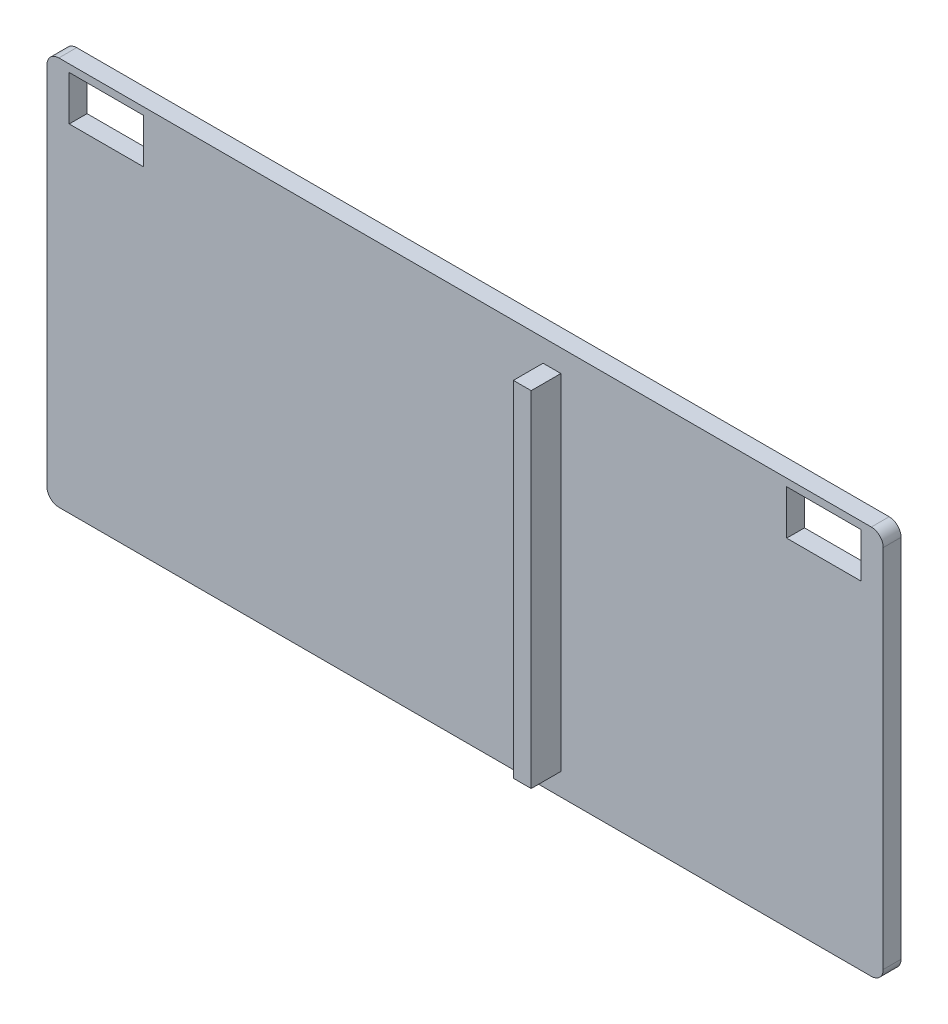
ISO-10303-21;
HEADER;
FILE_DESCRIPTION(('STEP AP214'),'2;1');
FILE_NAME('part.step','',(''),(''),'','','');
FILE_SCHEMA(('AUTOMOTIVE_DESIGN { 1 0 10303 214 1 1 1 1 }'));
ENDSEC;
DATA;
#1=APPLICATION_CONTEXT('core data for automotive mechanical design processes');
#2=APPLICATION_PROTOCOL_DEFINITION('international standard','automotive_design',2000,#1);
#3=PRODUCT_CONTEXT('',#1,'mechanical');
#4=PRODUCT('Part','Part','',(#3));
#5=PRODUCT_RELATED_PRODUCT_CATEGORY('part','',(#4));
#6=PRODUCT_DEFINITION_FORMATION('','',#4);
#7=PRODUCT_DEFINITION_CONTEXT('part definition',#1,'design');
#8=PRODUCT_DEFINITION('design','',#6,#7);
#9=PRODUCT_DEFINITION_SHAPE('','',#8);
#10=(LENGTH_UNIT() NAMED_UNIT(*) SI_UNIT(.MILLI.,.METRE.));
#11=(NAMED_UNIT(*) PLANE_ANGLE_UNIT() SI_UNIT($,.RADIAN.));
#12=(NAMED_UNIT(*) SI_UNIT($,.STERADIAN.) SOLID_ANGLE_UNIT());
#13=UNCERTAINTY_MEASURE_WITH_UNIT(LENGTH_MEASURE(1.E-05),#10,'distance_accuracy_value','');
#14=(GEOMETRIC_REPRESENTATION_CONTEXT(3) GLOBAL_UNCERTAINTY_ASSIGNED_CONTEXT((#13)) GLOBAL_UNIT_ASSIGNED_CONTEXT((#10,
#11,#12)) REPRESENTATION_CONTEXT('',''));
#15=CARTESIAN_POINT('',(0.,0.,0.));
#16=DIRECTION('',(0.,0.,1.));
#17=DIRECTION('',(1.,0.,0.));
#18=AXIS2_PLACEMENT_3D('',#15,#16,#17);
#19=CARTESIAN_POINT('',(5.25,-11.6,11.8));
#20=DIRECTION('',(0.,0.,1.));
#21=DIRECTION('',(1.,0.,0.));
#22=AXIS2_PLACEMENT_3D('',#19,#20,#21);
#23=PLANE('',#22);
#24=DIRECTION('',(0.,1.,0.));
#25=VECTOR('',#24,1.);
#26=CARTESIAN_POINT('',(5.25,-11.6,11.8));
#27=LINE('',#26,#25);
#28=CARTESIAN_POINT('',(5.25,-11.6,11.8));
#29=VERTEX_POINT('',#28);
#30=CARTESIAN_POINT('',(5.25,11.6,11.8));
#31=VERTEX_POINT('',#30);
#32=EDGE_CURVE('E208',#29,#31,#27,.T.);
#33=ORIENTED_EDGE('',*,*,#32,.F.);
#34=DIRECTION('',(1.,0.,0.));
#35=VECTOR('',#34,1.);
#36=CARTESIAN_POINT('',(5.25,-11.6,11.8));
#37=LINE('',#36,#35);
#38=CARTESIAN_POINT('',(6.45,-11.6,11.8));
#39=VERTEX_POINT('',#38);
#40=EDGE_CURVE('E325',#29,#39,#37,.T.);
#41=ORIENTED_EDGE('',*,*,#40,.T.);
#42=DIRECTION('',(0.,1.,0.));
#43=VECTOR('',#42,1.);
#44=CARTESIAN_POINT('',(6.45,-11.6,11.8));
#45=LINE('',#44,#43);
#46=CARTESIAN_POINT('',(6.45,11.6,11.8));
#47=VERTEX_POINT('',#46);
#48=EDGE_CURVE('E40',#39,#47,#45,.T.);
#49=ORIENTED_EDGE('',*,*,#48,.T.);
#50=DIRECTION('',(1.,0.,0.));
#51=VECTOR('',#50,1.);
#52=CARTESIAN_POINT('',(5.25,11.6,11.8));
#53=LINE('',#52,#51);
#54=EDGE_CURVE('E364',#31,#47,#53,.T.);
#55=ORIENTED_EDGE('',*,*,#54,.F.);
#56=EDGE_LOOP('',(#33,#41,#49,#55));
#57=FACE_BOUND('',#56,.T.);
#58=ADVANCED_FACE('F16',(#57),#23,.T.);
#59=CARTESIAN_POINT('',(21.65,12.6,8.6));
#60=DIRECTION('',(0.,1.,0.));
#61=DIRECTION('',(1.,0.,0.));
#62=AXIS2_PLACEMENT_3D('',#59,#60,#61);
#63=PLANE('',#62);
#64=DIRECTION('',(0.,0.,1.));
#65=VECTOR('',#64,1.);
#66=CARTESIAN_POINT('',(26.65,12.6,8.6));
#67=LINE('',#66,#65);
#68=CARTESIAN_POINT('',(26.65,12.6,8.6));
#69=VERTEX_POINT('',#68);
#70=CARTESIAN_POINT('',(26.65,12.6,9.8));
#71=VERTEX_POINT('',#70);
#72=EDGE_CURVE('E10',#69,#71,#67,.T.);
#73=ORIENTED_EDGE('',*,*,#72,.T.);
#74=DIRECTION('',(1.,0.,0.));
#75=VECTOR('',#74,1.);
#76=CARTESIAN_POINT('',(21.65,12.6,9.8));
#77=LINE('',#76,#75);
#78=CARTESIAN_POINT('',(21.65,12.6,9.8));
#79=VERTEX_POINT('',#78);
#80=EDGE_CURVE('E271',#79,#71,#77,.T.);
#81=ORIENTED_EDGE('',*,*,#80,.F.);
#82=DIRECTION('',(0.,0.,1.));
#83=VECTOR('',#82,1.);
#84=CARTESIAN_POINT('',(21.65,12.6,8.6));
#85=LINE('',#84,#83);
#86=CARTESIAN_POINT('',(21.65,12.6,8.6));
#87=VERTEX_POINT('',#86);
#88=EDGE_CURVE('E391',#87,#79,#85,.T.);
#89=ORIENTED_EDGE('',*,*,#88,.F.);
#90=DIRECTION('',(1.,0.,0.));
#91=VECTOR('',#90,1.);
#92=CARTESIAN_POINT('',(21.65,12.6,8.6));
#93=LINE('',#92,#91);
#94=EDGE_CURVE('E345',#87,#69,#93,.T.);
#95=ORIENTED_EDGE('',*,*,#94,.T.);
#96=EDGE_LOOP('',(#73,#81,#89,#95));
#97=FACE_BOUND('',#96,.T.);
#98=ADVANCED_FACE('F411',(#97),#63,.F.);
#99=CARTESIAN_POINT('',(26.65,9.6,8.6));
#100=DIRECTION('',(1.,0.,0.));
#101=DIRECTION('',(0.,1.,0.));
#102=AXIS2_PLACEMENT_3D('',#99,#100,#101);
#103=PLANE('',#102);
#104=DIRECTION('',(0.,1.,0.));
#105=VECTOR('',#104,1.);
#106=CARTESIAN_POINT('',(26.65,9.6,9.8));
#107=LINE('',#106,#105);
#108=CARTESIAN_POINT('',(26.65,9.6,9.8));
#109=VERTEX_POINT('',#108);
#110=EDGE_CURVE('E273',#109,#71,#107,.T.);
#111=ORIENTED_EDGE('',*,*,#110,.T.);
#112=ORIENTED_EDGE('',*,*,#72,.F.);
#113=DIRECTION('',(0.,1.,0.));
#114=VECTOR('',#113,1.);
#115=CARTESIAN_POINT('',(26.65,9.6,8.6));
#116=LINE('',#115,#114);
#117=CARTESIAN_POINT('',(26.65,9.6,8.6));
#118=VERTEX_POINT('',#117);
#119=EDGE_CURVE('E339',#118,#69,#116,.T.);
#120=ORIENTED_EDGE('',*,*,#119,.F.);
#121=DIRECTION('',(0.,0.,1.));
#122=VECTOR('',#121,1.);
#123=CARTESIAN_POINT('',(26.65,9.6,8.6));
#124=LINE('',#123,#122);
#125=EDGE_CURVE('E19',#118,#109,#124,.T.);
#126=ORIENTED_EDGE('',*,*,#125,.T.);
#127=EDGE_LOOP('',(#111,#112,#120,#126));
#128=FACE_BOUND('',#127,.T.);
#129=ADVANCED_FACE('F401',(#128),#103,.F.);
#130=CARTESIAN_POINT('',(21.65,9.6,8.6));
#131=DIRECTION('',(0.,1.,0.));
#132=DIRECTION('',(1.,0.,0.));
#133=AXIS2_PLACEMENT_3D('',#130,#131,#132);
#134=PLANE('',#133);
#135=DIRECTION('',(1.,0.,0.));
#136=VECTOR('',#135,1.);
#137=CARTESIAN_POINT('',(21.65,9.6,8.6));
#138=LINE('',#137,#136);
#139=CARTESIAN_POINT('',(21.65,9.6,8.6));
#140=VERTEX_POINT('',#139);
#141=EDGE_CURVE('E331',#140,#118,#138,.T.);
#142=ORIENTED_EDGE('',*,*,#141,.F.);
#143=DIRECTION('',(0.,0.,1.));
#144=VECTOR('',#143,1.);
#145=CARTESIAN_POINT('',(21.65,9.6,8.6));
#146=LINE('',#145,#144);
#147=CARTESIAN_POINT('',(21.65,9.6,9.8));
#148=VERTEX_POINT('',#147);
#149=EDGE_CURVE('E386',#140,#148,#146,.T.);
#150=ORIENTED_EDGE('',*,*,#149,.T.);
#151=DIRECTION('',(1.,0.,0.));
#152=VECTOR('',#151,1.);
#153=CARTESIAN_POINT('',(21.65,9.6,9.8));
#154=LINE('',#153,#152);
#155=EDGE_CURVE('E276',#148,#109,#154,.T.);
#156=ORIENTED_EDGE('',*,*,#155,.T.);
#157=ORIENTED_EDGE('',*,*,#125,.F.);
#158=EDGE_LOOP('',(#142,#150,#156,#157));
#159=FACE_BOUND('',#158,.T.);
#160=ADVANCED_FACE('F410',(#159),#134,.T.);
#161=CARTESIAN_POINT('',(21.65,9.6,8.6));
#162=DIRECTION('',(1.,0.,0.));
#163=DIRECTION('',(0.,1.,0.));
#164=AXIS2_PLACEMENT_3D('',#161,#162,#163);
#165=PLANE('',#164);
#166=ORIENTED_EDGE('',*,*,#149,.F.);
#167=DIRECTION('',(0.,1.,0.));
#168=VECTOR('',#167,1.);
#169=CARTESIAN_POINT('',(21.65,9.6,8.6));
#170=LINE('',#169,#168);
#171=EDGE_CURVE('E350',#140,#87,#170,.T.);
#172=ORIENTED_EDGE('',*,*,#171,.T.);
#173=ORIENTED_EDGE('',*,*,#88,.T.);
#174=DIRECTION('',(0.,1.,0.));
#175=VECTOR('',#174,1.);
#176=CARTESIAN_POINT('',(21.65,9.6,9.8));
#177=LINE('',#176,#175);
#178=EDGE_CURVE('E270',#148,#79,#177,.T.);
#179=ORIENTED_EDGE('',*,*,#178,.F.);
#180=EDGE_LOOP('',(#166,#172,#173,#179));
#181=FACE_BOUND('',#180,.T.);
#182=ADVANCED_FACE('F417',(#181),#165,.T.);
#183=CARTESIAN_POINT('',(-21.65,9.6,8.6));
#184=DIRECTION('',(1.,0.,0.));
#185=DIRECTION('',(0.,1.,0.));
#186=AXIS2_PLACEMENT_3D('',#183,#184,#185);
#187=PLANE('',#186);
#188=DIRECTION('',(0.,1.,0.));
#189=VECTOR('',#188,1.);
#190=CARTESIAN_POINT('',(-21.65,9.6,9.8));
#191=LINE('',#190,#189);
#192=CARTESIAN_POINT('',(-21.65,9.6,9.8));
#193=VERTEX_POINT('',#192);
#194=CARTESIAN_POINT('',(-21.65,12.6,9.8));
#195=VERTEX_POINT('',#194);
#196=EDGE_CURVE('E265',#193,#195,#191,.T.);
#197=ORIENTED_EDGE('',*,*,#196,.T.);
#198=DIRECTION('',(0.,0.,1.));
#199=VECTOR('',#198,1.);
#200=CARTESIAN_POINT('',(-21.65,12.6,8.6));
#201=LINE('',#200,#199);
#202=CARTESIAN_POINT('',(-21.65,12.6,8.6));
#203=VERTEX_POINT('',#202);
#204=EDGE_CURVE('E382',#203,#195,#201,.T.);
#205=ORIENTED_EDGE('',*,*,#204,.F.);
#206=DIRECTION('',(0.,1.,0.));
#207=VECTOR('',#206,1.);
#208=CARTESIAN_POINT('',(-21.65,9.6,8.6));
#209=LINE('',#208,#207);
#210=CARTESIAN_POINT('',(-21.65,9.6,8.6));
#211=VERTEX_POINT('',#210);
#212=EDGE_CURVE('E318',#211,#203,#209,.T.);
#213=ORIENTED_EDGE('',*,*,#212,.F.);
#214=DIRECTION('',(0.,0.,1.));
#215=VECTOR('',#214,1.);
#216=CARTESIAN_POINT('',(-21.65,9.6,8.6));
#217=LINE('',#216,#215);
#218=EDGE_CURVE('E387',#211,#193,#217,.T.);
#219=ORIENTED_EDGE('',*,*,#218,.T.);
#220=EDGE_LOOP('',(#197,#205,#213,#219));
#221=FACE_BOUND('',#220,.T.);
#222=ADVANCED_FACE('F420',(#221),#187,.F.);
#223=CARTESIAN_POINT('',(-26.65,9.6,8.6));
#224=DIRECTION('',(0.,1.,0.));
#225=DIRECTION('',(1.,0.,0.));
#226=AXIS2_PLACEMENT_3D('',#223,#224,#225);
#227=PLANE('',#226);
#228=DIRECTION('',(1.,0.,0.));
#229=VECTOR('',#228,1.);
#230=CARTESIAN_POINT('',(-26.65,9.6,8.6));
#231=LINE('',#230,#229);
#232=CARTESIAN_POINT('',(-26.65,9.6,8.6));
#233=VERTEX_POINT('',#232);
#234=EDGE_CURVE('E314',#233,#211,#231,.T.);
#235=ORIENTED_EDGE('',*,*,#234,.F.);
#236=DIRECTION('',(0.,0.,1.));
#237=VECTOR('',#236,1.);
#238=CARTESIAN_POINT('',(-26.65,9.6,8.6));
#239=LINE('',#238,#237);
#240=CARTESIAN_POINT('',(-26.65,9.6,9.8));
#241=VERTEX_POINT('',#240);
#242=EDGE_CURVE('E321',#233,#241,#239,.T.);
#243=ORIENTED_EDGE('',*,*,#242,.T.);
#244=DIRECTION('',(1.,0.,0.));
#245=VECTOR('',#244,1.);
#246=CARTESIAN_POINT('',(-26.65,9.6,9.8));
#247=LINE('',#246,#245);
#248=EDGE_CURVE('E263',#241,#193,#247,.T.);
#249=ORIENTED_EDGE('',*,*,#248,.T.);
#250=ORIENTED_EDGE('',*,*,#218,.F.);
#251=EDGE_LOOP('',(#235,#243,#249,#250));
#252=FACE_BOUND('',#251,.T.);
#253=ADVANCED_FACE('F426',(#252),#227,.T.);
#254=CARTESIAN_POINT('',(-26.65,12.6,8.6));
#255=DIRECTION('',(0.,1.,0.));
#256=DIRECTION('',(1.,0.,0.));
#257=AXIS2_PLACEMENT_3D('',#254,#255,#256);
#258=PLANE('',#257);
#259=ORIENTED_EDGE('',*,*,#204,.T.);
#260=DIRECTION('',(1.,0.,0.));
#261=VECTOR('',#260,1.);
#262=CARTESIAN_POINT('',(-26.65,12.6,9.8));
#263=LINE('',#262,#261);
#264=CARTESIAN_POINT('',(-26.65,12.6,9.8));
#265=VERTEX_POINT('',#264);
#266=EDGE_CURVE('E238',#265,#195,#263,.T.);
#267=ORIENTED_EDGE('',*,*,#266,.F.);
#268=DIRECTION('',(0.,0.,1.));
#269=VECTOR('',#268,1.);
#270=CARTESIAN_POINT('',(-26.65,12.6,8.6));
#271=LINE('',#270,#269);
#272=CARTESIAN_POINT('',(-26.65,12.6,8.6));
#273=VERTEX_POINT('',#272);
#274=EDGE_CURVE('E379',#273,#265,#271,.T.);
#275=ORIENTED_EDGE('',*,*,#274,.F.);
#276=DIRECTION('',(1.,0.,0.));
#277=VECTOR('',#276,1.);
#278=CARTESIAN_POINT('',(-26.65,12.6,8.6));
#279=LINE('',#278,#277);
#280=EDGE_CURVE('E326',#273,#203,#279,.T.);
#281=ORIENTED_EDGE('',*,*,#280,.T.);
#282=EDGE_LOOP('',(#259,#267,#275,#281));
#283=FACE_BOUND('',#282,.T.);
#284=ADVANCED_FACE('F521',(#283),#258,.F.);
#285=CARTESIAN_POINT('',(-26.65,9.6,8.6));
#286=DIRECTION('',(1.,0.,0.));
#287=DIRECTION('',(0.,1.,0.));
#288=AXIS2_PLACEMENT_3D('',#285,#286,#287);
#289=PLANE('',#288);
#290=ORIENTED_EDGE('',*,*,#242,.F.);
#291=DIRECTION('',(0.,1.,0.));
#292=VECTOR('',#291,1.);
#293=CARTESIAN_POINT('',(-26.65,9.6,8.6));
#294=LINE('',#293,#292);
#295=EDGE_CURVE('E329',#233,#273,#294,.T.);
#296=ORIENTED_EDGE('',*,*,#295,.T.);
#297=ORIENTED_EDGE('',*,*,#274,.T.);
#298=DIRECTION('',(0.,1.,0.));
#299=VECTOR('',#298,1.);
#300=CARTESIAN_POINT('',(-26.65,9.6,9.8));
#301=LINE('',#300,#299);
#302=EDGE_CURVE('E234',#241,#265,#301,.T.);
#303=ORIENTED_EDGE('',*,*,#302,.F.);
#304=EDGE_LOOP('',(#290,#296,#297,#303));
#305=FACE_BOUND('',#304,.T.);
#306=ADVANCED_FACE('F520',(#305),#289,.T.);
#307=CARTESIAN_POINT('',(6.45,-11.6,9.8));
#308=DIRECTION('',(1.,0.,0.));
#309=DIRECTION('',(0.,1.,0.));
#310=AXIS2_PLACEMENT_3D('',#307,#308,#309);
#311=PLANE('',#310);
#312=DIRECTION('',(0.,0.,1.));
#313=VECTOR('',#312,1.);
#314=CARTESIAN_POINT('',(6.45,-11.6,9.8));
#315=LINE('',#314,#313);
#316=CARTESIAN_POINT('',(6.45,-11.6,9.8));
#317=VERTEX_POINT('',#316);
#318=EDGE_CURVE('E375',#317,#39,#315,.T.);
#319=ORIENTED_EDGE('',*,*,#318,.F.);
#320=DIRECTION('',(0.,1.,0.));
#321=VECTOR('',#320,1.);
#322=CARTESIAN_POINT('',(6.45,-11.6,9.8));
#323=LINE('',#322,#321);
#324=CARTESIAN_POINT('',(6.45,11.6,9.8));
#325=VERTEX_POINT('',#324);
#326=EDGE_CURVE('E254',#317,#325,#323,.T.);
#327=ORIENTED_EDGE('',*,*,#326,.T.);
#328=DIRECTION('',(0.,0.,1.));
#329=VECTOR('',#328,1.);
#330=CARTESIAN_POINT('',(6.45,11.6,9.8));
#331=LINE('',#330,#329);
#332=EDGE_CURVE('E369',#325,#47,#331,.T.);
#333=ORIENTED_EDGE('',*,*,#332,.T.);
#334=ORIENTED_EDGE('',*,*,#48,.F.);
#335=EDGE_LOOP('',(#319,#327,#333,#334));
#336=FACE_BOUND('',#335,.T.);
#337=ADVANCED_FACE('F519',(#336),#311,.T.);
#338=CARTESIAN_POINT('',(5.25,-11.6,9.8));
#339=DIRECTION('',(0.,1.,0.));
#340=DIRECTION('',(1.,0.,0.));
#341=AXIS2_PLACEMENT_3D('',#338,#339,#340);
#342=PLANE('',#341);
#343=ORIENTED_EDGE('',*,*,#318,.T.);
#344=ORIENTED_EDGE('',*,*,#40,.F.);
#345=DIRECTION('',(0.,0.,1.));
#346=VECTOR('',#345,1.);
#347=CARTESIAN_POINT('',(5.25,-11.6,9.8));
#348=LINE('',#347,#346);
#349=CARTESIAN_POINT('',(5.25,-11.6,9.8));
#350=VERTEX_POINT('',#349);
#351=EDGE_CURVE('E363',#350,#29,#348,.T.);
#352=ORIENTED_EDGE('',*,*,#351,.F.);
#353=DIRECTION('',(1.,0.,0.));
#354=VECTOR('',#353,1.);
#355=CARTESIAN_POINT('',(5.25,-11.6,9.8));
#356=LINE('',#355,#354);
#357=EDGE_CURVE('E237',#350,#317,#356,.T.);
#358=ORIENTED_EDGE('',*,*,#357,.T.);
#359=EDGE_LOOP('',(#343,#344,#352,#358));
#360=FACE_BOUND('',#359,.T.);
#361=ADVANCED_FACE('F441',(#360),#342,.F.);
#362=CARTESIAN_POINT('',(5.25,11.6,9.8));
#363=DIRECTION('',(0.,1.,0.));
#364=DIRECTION('',(1.,0.,0.));
#365=AXIS2_PLACEMENT_3D('',#362,#363,#364);
#366=PLANE('',#365);
#367=DIRECTION('',(1.,0.,0.));
#368=VECTOR('',#367,1.);
#369=CARTESIAN_POINT('',(5.25,11.6,9.8));
#370=LINE('',#369,#368);
#371=CARTESIAN_POINT('',(5.25,11.6,9.8));
#372=VERTEX_POINT('',#371);
#373=EDGE_CURVE('E253',#372,#325,#370,.T.);
#374=ORIENTED_EDGE('',*,*,#373,.F.);
#375=DIRECTION('',(0.,0.,1.));
#376=VECTOR('',#375,1.);
#377=CARTESIAN_POINT('',(5.25,11.6,9.8));
#378=LINE('',#377,#376);
#379=EDGE_CURVE('E360',#372,#31,#378,.T.);
#380=ORIENTED_EDGE('',*,*,#379,.T.);
#381=ORIENTED_EDGE('',*,*,#54,.T.);
#382=ORIENTED_EDGE('',*,*,#332,.F.);
#383=EDGE_LOOP('',(#374,#380,#381,#382));
#384=FACE_BOUND('',#383,.T.);
#385=ADVANCED_FACE('F527',(#384),#366,.T.);
#386=CARTESIAN_POINT('',(5.25,-11.6,9.8));
#387=DIRECTION('',(1.,0.,0.));
#388=DIRECTION('',(0.,1.,0.));
#389=AXIS2_PLACEMENT_3D('',#386,#387,#388);
#390=PLANE('',#389);
#391=ORIENTED_EDGE('',*,*,#32,.T.);
#392=ORIENTED_EDGE('',*,*,#379,.F.);
#393=DIRECTION('',(0.,1.,0.));
#394=VECTOR('',#393,1.);
#395=CARTESIAN_POINT('',(5.25,-11.6,9.8));
#396=LINE('',#395,#394);
#397=EDGE_CURVE('E250',#350,#372,#396,.T.);
#398=ORIENTED_EDGE('',*,*,#397,.F.);
#399=ORIENTED_EDGE('',*,*,#351,.T.);
#400=EDGE_LOOP('',(#391,#392,#398,#399));
#401=FACE_BOUND('',#400,.T.);
#402=ADVANCED_FACE('F437',(#401),#390,.F.);
#403=CARTESIAN_POINT('',(28.15,-13.1,8.6));
#404=DIRECTION('',(1.,0.,0.));
#405=DIRECTION('',(0.,1.,0.));
#406=AXIS2_PLACEMENT_3D('',#403,#404,#405);
#407=PLANE('',#406);
#408=DIRECTION('',(0.,1.,0.));
#409=VECTOR('',#408,1.);
#410=CARTESIAN_POINT('',(28.15,-13.1,9.8));
#411=LINE('',#410,#409);
#412=CARTESIAN_POINT('',(28.15,-12.3,9.8));
#413=VERTEX_POINT('',#412);
#414=CARTESIAN_POINT('',(28.15,12.3,9.8));
#415=VERTEX_POINT('',#414);
#416=EDGE_CURVE('E199',#413,#415,#411,.T.);
#417=ORIENTED_EDGE('',*,*,#416,.F.);
#418=DIRECTION('',(0.,0.,1.));
#419=VECTOR('',#418,1.);
#420=CARTESIAN_POINT('',(28.15,-12.3,8.6));
#421=LINE('',#420,#419);
#422=CARTESIAN_POINT('',(28.15,-12.3,8.6));
#423=VERTEX_POINT('',#422);
#424=EDGE_CURVE('E207',#423,#413,#421,.T.);
#425=ORIENTED_EDGE('',*,*,#424,.F.);
#426=DIRECTION('',(0.,1.,0.));
#427=VECTOR('',#426,1.);
#428=CARTESIAN_POINT('',(28.15,-13.1,8.6));
#429=LINE('',#428,#427);
#430=CARTESIAN_POINT('',(28.15,12.3,8.6));
#431=VERTEX_POINT('',#430);
#432=EDGE_CURVE('E201',#423,#431,#429,.T.);
#433=ORIENTED_EDGE('',*,*,#432,.T.);
#434=DIRECTION('',(0.,0.,1.));
#435=VECTOR('',#434,1.);
#436=CARTESIAN_POINT('',(28.15,12.3,8.6));
#437=LINE('',#436,#435);
#438=EDGE_CURVE('E198',#431,#415,#437,.T.);
#439=ORIENTED_EDGE('',*,*,#438,.T.);
#440=EDGE_LOOP('',(#417,#425,#433,#439));
#441=FACE_BOUND('',#440,.T.);
#442=ADVANCED_FACE('F196',(#441),#407,.T.);
#443=CARTESIAN_POINT('',(27.35,12.3,8.6));
#444=DIRECTION('',(0.,0.,1.));
#445=DIRECTION('',(1.,0.,0.));
#446=AXIS2_PLACEMENT_3D('',#443,#444,#445);
#447=CYLINDRICAL_SURFACE('',#446,0.8);
#448=CARTESIAN_POINT('',(27.35,12.3,8.6));
#449=DIRECTION('',(0.,0.,1.));
#450=DIRECTION('',(0.,-1.,0.));
#451=AXIS2_PLACEMENT_3D('',#448,#449,#450);
#452=CIRCLE('',#451,0.8);
#453=CARTESIAN_POINT('',(27.35,13.1,8.6));
#454=VERTEX_POINT('',#453);
#455=EDGE_CURVE('E301',#431,#454,#452,.T.);
#456=ORIENTED_EDGE('',*,*,#455,.T.);
#457=DIRECTION('',(0.,0.,1.));
#458=VECTOR('',#457,1.);
#459=CARTESIAN_POINT('',(27.35,13.1,8.6));
#460=LINE('',#459,#458);
#461=CARTESIAN_POINT('',(27.35,13.1,9.8));
#462=VERTEX_POINT('',#461);
#463=EDGE_CURVE('E212',#454,#462,#460,.T.);
#464=ORIENTED_EDGE('',*,*,#463,.T.);
#465=CARTESIAN_POINT('',(27.35,12.3,9.8));
#466=DIRECTION('',(0.,0.,1.));
#467=DIRECTION('',(0.,-1.,0.));
#468=AXIS2_PLACEMENT_3D('',#465,#466,#467);
#469=CIRCLE('',#468,0.8);
#470=EDGE_CURVE('E215',#415,#462,#469,.T.);
#471=ORIENTED_EDGE('',*,*,#470,.F.);
#472=ORIENTED_EDGE('',*,*,#438,.F.);
#473=EDGE_LOOP('',(#456,#464,#471,#472));
#474=FACE_BOUND('',#473,.T.);
#475=ADVANCED_FACE('F213',(#474),#447,.T.);
#476=CARTESIAN_POINT('',(27.35,-12.3,8.6));
#477=DIRECTION('',(0.,0.,1.));
#478=DIRECTION('',(1.,0.,0.));
#479=AXIS2_PLACEMENT_3D('',#476,#477,#478);
#480=CYLINDRICAL_SURFACE('',#479,0.8);
#481=ORIENTED_EDGE('',*,*,#424,.T.);
#482=CARTESIAN_POINT('',(27.35,-12.3,9.8));
#483=DIRECTION('',(0.,0.,-1.));
#484=DIRECTION('',(0.,-1.,0.));
#485=AXIS2_PLACEMENT_3D('',#482,#483,#484);
#486=CIRCLE('',#485,0.8);
#487=CARTESIAN_POINT('',(27.35,-13.1,9.8));
#488=VERTEX_POINT('',#487);
#489=EDGE_CURVE('E223',#413,#488,#486,.T.);
#490=ORIENTED_EDGE('',*,*,#489,.T.);
#491=DIRECTION('',(0.,0.,1.));
#492=VECTOR('',#491,1.);
#493=CARTESIAN_POINT('',(27.35,-13.1,8.6));
#494=LINE('',#493,#492);
#495=CARTESIAN_POINT('',(27.35,-13.1,8.6));
#496=VERTEX_POINT('',#495);
#497=EDGE_CURVE('E245',#496,#488,#494,.T.);
#498=ORIENTED_EDGE('',*,*,#497,.F.);
#499=CARTESIAN_POINT('',(27.35,-12.3,8.6));
#500=DIRECTION('',(0.,0.,-1.));
#501=DIRECTION('',(0.,-1.,0.));
#502=AXIS2_PLACEMENT_3D('',#499,#500,#501);
#503=CIRCLE('',#502,0.8);
#504=EDGE_CURVE('E308',#423,#496,#503,.T.);
#505=ORIENTED_EDGE('',*,*,#504,.F.);
#506=EDGE_LOOP('',(#481,#490,#498,#505));
#507=FACE_BOUND('',#506,.T.);
#508=ADVANCED_FACE('F485',(#507),#480,.T.);
#509=CARTESIAN_POINT('',(-28.15,13.1,8.6));
#510=DIRECTION('',(0.,1.,0.));
#511=DIRECTION('',(1.,0.,0.));
#512=AXIS2_PLACEMENT_3D('',#509,#510,#511);
#513=PLANE('',#512);
#514=DIRECTION('',(1.,0.,0.));
#515=VECTOR('',#514,1.);
#516=CARTESIAN_POINT('',(-28.15,13.1,8.6));
#517=LINE('',#516,#515);
#518=CARTESIAN_POINT('',(-27.35,13.1,8.6));
#519=VERTEX_POINT('',#518);
#520=EDGE_CURVE('E300',#519,#454,#517,.T.);
#521=ORIENTED_EDGE('',*,*,#520,.F.);
#522=DIRECTION('',(0.,0.,1.));
#523=VECTOR('',#522,1.);
#524=CARTESIAN_POINT('',(-27.35,13.1,8.6));
#525=LINE('',#524,#523);
#526=CARTESIAN_POINT('',(-27.35,13.1,9.8));
#527=VERTEX_POINT('',#526);
#528=EDGE_CURVE('E289',#519,#527,#525,.T.);
#529=ORIENTED_EDGE('',*,*,#528,.T.);
#530=DIRECTION('',(1.,0.,0.));
#531=VECTOR('',#530,1.);
#532=CARTESIAN_POINT('',(-28.15,13.1,9.8));
#533=LINE('',#532,#531);
#534=EDGE_CURVE('E218',#527,#462,#533,.T.);
#535=ORIENTED_EDGE('',*,*,#534,.T.);
#536=ORIENTED_EDGE('',*,*,#463,.F.);
#537=EDGE_LOOP('',(#521,#529,#535,#536));
#538=FACE_BOUND('',#537,.T.);
#539=ADVANCED_FACE('F486',(#538),#513,.T.);
#540=CARTESIAN_POINT('',(-28.15,-13.1,8.6));
#541=DIRECTION('',(0.,1.,0.));
#542=DIRECTION('',(1.,0.,0.));
#543=AXIS2_PLACEMENT_3D('',#540,#541,#542);
#544=PLANE('',#543);
#545=ORIENTED_EDGE('',*,*,#497,.T.);
#546=DIRECTION('',(1.,0.,0.));
#547=VECTOR('',#546,1.);
#548=CARTESIAN_POINT('',(-28.15,-13.1,9.8));
#549=LINE('',#548,#547);
#550=CARTESIAN_POINT('',(-27.35,-13.1,9.8));
#551=VERTEX_POINT('',#550);
#552=EDGE_CURVE('E231',#551,#488,#549,.T.);
#553=ORIENTED_EDGE('',*,*,#552,.F.);
#554=DIRECTION('',(0.,0.,1.));
#555=VECTOR('',#554,1.);
#556=CARTESIAN_POINT('',(-27.35,-13.1,8.6));
#557=LINE('',#556,#555);
#558=CARTESIAN_POINT('',(-27.35,-13.1,8.6));
#559=VERTEX_POINT('',#558);
#560=EDGE_CURVE('E290',#559,#551,#557,.T.);
#561=ORIENTED_EDGE('',*,*,#560,.F.);
#562=DIRECTION('',(1.,0.,0.));
#563=VECTOR('',#562,1.);
#564=CARTESIAN_POINT('',(-28.15,-13.1,8.6));
#565=LINE('',#564,#563);
#566=EDGE_CURVE('E309',#559,#496,#565,.T.);
#567=ORIENTED_EDGE('',*,*,#566,.T.);
#568=EDGE_LOOP('',(#545,#553,#561,#567));
#569=FACE_BOUND('',#568,.T.);
#570=ADVANCED_FACE('F479',(#569),#544,.F.);
#571=CARTESIAN_POINT('',(-28.15,-13.1,8.6));
#572=DIRECTION('',(0.,0.,1.));
#573=DIRECTION('',(1.,0.,0.));
#574=AXIS2_PLACEMENT_3D('',#571,#572,#573);
#575=PLANE('',#574);
#576=ORIENTED_EDGE('',*,*,#141,.T.);
#577=ORIENTED_EDGE('',*,*,#119,.T.);
#578=ORIENTED_EDGE('',*,*,#94,.F.);
#579=ORIENTED_EDGE('',*,*,#171,.F.);
#580=EDGE_LOOP('',(#576,#577,#578,#579));
#581=FACE_BOUND('',#580,.T.);
#582=ORIENTED_EDGE('',*,*,#234,.T.);
#583=ORIENTED_EDGE('',*,*,#212,.T.);
#584=ORIENTED_EDGE('',*,*,#280,.F.);
#585=ORIENTED_EDGE('',*,*,#295,.F.);
#586=EDGE_LOOP('',(#582,#583,#584,#585));
#587=FACE_BOUND('',#586,.T.);
#588=CARTESIAN_POINT('',(-27.35,12.3,8.6));
#589=DIRECTION('',(0.,0.,-1.));
#590=DIRECTION('',(0.,-1.,0.));
#591=AXIS2_PLACEMENT_3D('',#588,#589,#590);
#592=CIRCLE('',#591,0.8);
#593=CARTESIAN_POINT('',(-28.15,12.3,8.6));
#594=VERTEX_POINT('',#593);
#595=EDGE_CURVE('E293',#594,#519,#592,.T.);
#596=ORIENTED_EDGE('',*,*,#595,.T.);
#597=ORIENTED_EDGE('',*,*,#520,.T.);
#598=ORIENTED_EDGE('',*,*,#455,.F.);
#599=ORIENTED_EDGE('',*,*,#432,.F.);
#600=ORIENTED_EDGE('',*,*,#504,.T.);
#601=ORIENTED_EDGE('',*,*,#566,.F.);
#602=CARTESIAN_POINT('',(-27.35,-12.3,8.6));
#603=DIRECTION('',(0.,0.,1.));
#604=DIRECTION('',(0.,-1.,0.));
#605=AXIS2_PLACEMENT_3D('',#602,#603,#604);
#606=CIRCLE('',#605,0.8);
#607=CARTESIAN_POINT('',(-28.15,-12.3,8.6));
#608=VERTEX_POINT('',#607);
#609=EDGE_CURVE('E284',#608,#559,#606,.T.);
#610=ORIENTED_EDGE('',*,*,#609,.F.);
#611=DIRECTION('',(0.,1.,0.));
#612=VECTOR('',#611,1.);
#613=CARTESIAN_POINT('',(-28.15,-13.1,8.6));
#614=LINE('',#613,#612);
#615=EDGE_CURVE('E452',#608,#594,#614,.T.);
#616=ORIENTED_EDGE('',*,*,#615,.T.);
#617=EDGE_LOOP('',(#596,#597,#598,#599,#600,#601,#610,#616));
#618=FACE_BOUND('',#617,.T.);
#619=ADVANCED_FACE('F414',(#581,#587,#618),#575,.F.);
#620=CARTESIAN_POINT('',(-27.35,12.3,8.6));
#621=DIRECTION('',(0.,0.,1.));
#622=DIRECTION('',(-1.,0.,0.));
#623=AXIS2_PLACEMENT_3D('',#620,#621,#622);
#624=CYLINDRICAL_SURFACE('',#623,0.8);
#625=DIRECTION('',(0.,0.,1.));
#626=VECTOR('',#625,1.);
#627=CARTESIAN_POINT('',(-28.15,12.3,8.6));
#628=LINE('',#627,#626);
#629=CARTESIAN_POINT('',(-28.15,12.3,9.8));
#630=VERTEX_POINT('',#629);
#631=EDGE_CURVE('E455',#594,#630,#628,.T.);
#632=ORIENTED_EDGE('',*,*,#631,.T.);
#633=CARTESIAN_POINT('',(-27.35,12.3,9.8));
#634=DIRECTION('',(0.,0.,-1.));
#635=DIRECTION('',(0.,-1.,0.));
#636=AXIS2_PLACEMENT_3D('',#633,#634,#635);
#637=CIRCLE('',#636,0.8);
#638=EDGE_CURVE('E242',#630,#527,#637,.T.);
#639=ORIENTED_EDGE('',*,*,#638,.T.);
#640=ORIENTED_EDGE('',*,*,#528,.F.);
#641=ORIENTED_EDGE('',*,*,#595,.F.);
#642=EDGE_LOOP('',(#632,#639,#640,#641));
#643=FACE_BOUND('',#642,.T.);
#644=ADVANCED_FACE('F493',(#643),#624,.T.);
#645=CARTESIAN_POINT('',(-27.35,-12.3,8.6));
#646=DIRECTION('',(0.,0.,1.));
#647=DIRECTION('',(-1.,0.,0.));
#648=AXIS2_PLACEMENT_3D('',#645,#646,#647);
#649=CYLINDRICAL_SURFACE('',#648,0.8);
#650=ORIENTED_EDGE('',*,*,#609,.T.);
#651=ORIENTED_EDGE('',*,*,#560,.T.);
#652=CARTESIAN_POINT('',(-27.35,-12.3,9.8));
#653=DIRECTION('',(0.,0.,1.));
#654=DIRECTION('',(0.,-1.,0.));
#655=AXIS2_PLACEMENT_3D('',#652,#653,#654);
#656=CIRCLE('',#655,0.8);
#657=CARTESIAN_POINT('',(-28.15,-12.3,9.8));
#658=VERTEX_POINT('',#657);
#659=EDGE_CURVE('E467',#658,#551,#656,.T.);
#660=ORIENTED_EDGE('',*,*,#659,.F.);
#661=DIRECTION('',(0.,0.,1.));
#662=VECTOR('',#661,1.);
#663=CARTESIAN_POINT('',(-28.15,-12.3,8.6));
#664=LINE('',#663,#662);
#665=EDGE_CURVE('E458',#608,#658,#664,.T.);
#666=ORIENTED_EDGE('',*,*,#665,.F.);
#667=EDGE_LOOP('',(#650,#651,#660,#666));
#668=FACE_BOUND('',#667,.T.);
#669=ADVANCED_FACE('F496',(#668),#649,.T.);
#670=CARTESIAN_POINT('',(-28.15,-13.1,9.8));
#671=DIRECTION('',(0.,0.,1.));
#672=DIRECTION('',(1.,0.,0.));
#673=AXIS2_PLACEMENT_3D('',#670,#671,#672);
#674=PLANE('',#673);
#675=ORIENTED_EDGE('',*,*,#178,.T.);
#676=ORIENTED_EDGE('',*,*,#80,.T.);
#677=ORIENTED_EDGE('',*,*,#110,.F.);
#678=ORIENTED_EDGE('',*,*,#155,.F.);
#679=EDGE_LOOP('',(#675,#676,#677,#678));
#680=FACE_BOUND('',#679,.T.);
#681=ORIENTED_EDGE('',*,*,#302,.T.);
#682=ORIENTED_EDGE('',*,*,#266,.T.);
#683=ORIENTED_EDGE('',*,*,#196,.F.);
#684=ORIENTED_EDGE('',*,*,#248,.F.);
#685=EDGE_LOOP('',(#681,#682,#683,#684));
#686=FACE_BOUND('',#685,.T.);
#687=ORIENTED_EDGE('',*,*,#397,.T.);
#688=ORIENTED_EDGE('',*,*,#373,.T.);
#689=ORIENTED_EDGE('',*,*,#326,.F.);
#690=ORIENTED_EDGE('',*,*,#357,.F.);
#691=EDGE_LOOP('',(#687,#688,#689,#690));
#692=FACE_BOUND('',#691,.T.);
#693=DIRECTION('',(0.,1.,0.));
#694=VECTOR('',#693,1.);
#695=CARTESIAN_POINT('',(-28.15,-13.1,9.8));
#696=LINE('',#695,#694);
#697=EDGE_CURVE('E464',#658,#630,#696,.T.);
#698=ORIENTED_EDGE('',*,*,#697,.F.);
#699=ORIENTED_EDGE('',*,*,#659,.T.);
#700=ORIENTED_EDGE('',*,*,#552,.T.);
#701=ORIENTED_EDGE('',*,*,#489,.F.);
#702=ORIENTED_EDGE('',*,*,#416,.T.);
#703=ORIENTED_EDGE('',*,*,#470,.T.);
#704=ORIENTED_EDGE('',*,*,#534,.F.);
#705=ORIENTED_EDGE('',*,*,#638,.F.);
#706=EDGE_LOOP('',(#698,#699,#700,#701,#702,#703,#704,#705));
#707=FACE_BOUND('',#706,.T.);
#708=ADVANCED_FACE('F225',(#680,#686,#692,#707),#674,.T.);
#709=CARTESIAN_POINT('',(-28.15,-13.1,8.6));
#710=DIRECTION('',(1.,0.,0.));
#711=DIRECTION('',(0.,1.,0.));
#712=AXIS2_PLACEMENT_3D('',#709,#710,#711);
#713=PLANE('',#712);
#714=ORIENTED_EDGE('',*,*,#631,.F.);
#715=ORIENTED_EDGE('',*,*,#615,.F.);
#716=ORIENTED_EDGE('',*,*,#665,.T.);
#717=ORIENTED_EDGE('',*,*,#697,.T.);
#718=EDGE_LOOP('',(#714,#715,#716,#717));
#719=FACE_BOUND('',#718,.T.);
#720=ADVANCED_FACE('F491',(#719),#713,.F.);
#721=CLOSED_SHELL('',(#58,#98,#129,#160,#182,#222,#253,#284,#306,#337,#361,#385,#402,#442,#475,
#508,#539,#570,#619,#644,#669,#708,#720));
#722=MANIFOLD_SOLID_BREP('B1',#721);
#723=ADVANCED_BREP_SHAPE_REPRESENTATION('',(#18,#722),#14);
#724=SHAPE_DEFINITION_REPRESENTATION(#9,#723);
ENDSEC;
END-ISO-10303-21;
